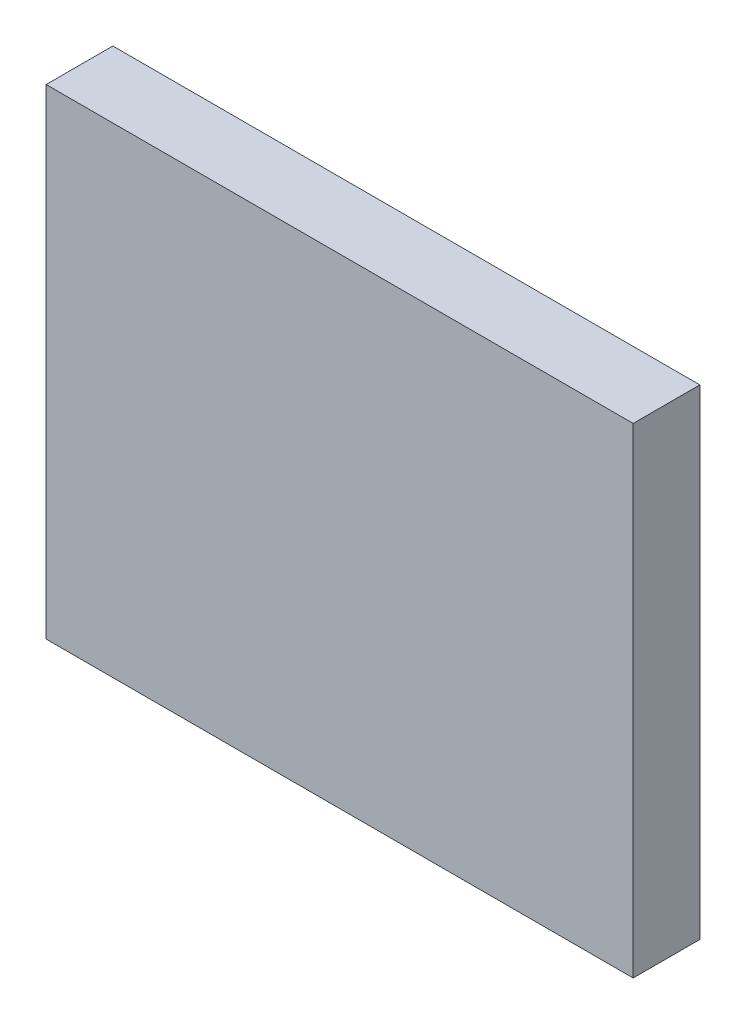
ISO-10303-21;
HEADER;
FILE_DESCRIPTION(('STEP AP214'),'2;1');
FILE_NAME('part.step','',(''),(''),'','','');
FILE_SCHEMA(('AUTOMOTIVE_DESIGN { 1 0 10303 214 1 1 1 1 }'));
ENDSEC;
DATA;
#1=APPLICATION_CONTEXT('core data for automotive mechanical design processes');
#2=APPLICATION_PROTOCOL_DEFINITION('international standard','automotive_design',2000,#1);
#3=PRODUCT_CONTEXT('',#1,'mechanical');
#4=PRODUCT('Part','Part','',(#3));
#5=PRODUCT_RELATED_PRODUCT_CATEGORY('part','',(#4));
#6=PRODUCT_DEFINITION_FORMATION('','',#4);
#7=PRODUCT_DEFINITION_CONTEXT('part definition',#1,'design');
#8=PRODUCT_DEFINITION('design','',#6,#7);
#9=PRODUCT_DEFINITION_SHAPE('','',#8);
#10=(LENGTH_UNIT() NAMED_UNIT(*) SI_UNIT(.MILLI.,.METRE.));
#11=(NAMED_UNIT(*) PLANE_ANGLE_UNIT() SI_UNIT($,.RADIAN.));
#12=(NAMED_UNIT(*) SI_UNIT($,.STERADIAN.) SOLID_ANGLE_UNIT());
#13=UNCERTAINTY_MEASURE_WITH_UNIT(LENGTH_MEASURE(1.E-05),#10,'distance_accuracy_value','');
#14=(GEOMETRIC_REPRESENTATION_CONTEXT(3) GLOBAL_UNCERTAINTY_ASSIGNED_CONTEXT((#13)) GLOBAL_UNIT_ASSIGNED_CONTEXT((#10,
#11,#12)) REPRESENTATION_CONTEXT('',''));
#15=CARTESIAN_POINT('',(0.,0.,0.));
#16=DIRECTION('',(0.,0.,1.));
#17=DIRECTION('',(1.,0.,0.));
#18=AXIS2_PLACEMENT_3D('',#15,#16,#17);
#19=CARTESIAN_POINT('',(0.,0.,10.));
#20=DIRECTION('',(1.,0.,0.));
#21=DIRECTION('',(0.,0.,-1.));
#22=AXIS2_PLACEMENT_3D('',#19,#20,#21);
#23=PLANE('',#22);
#24=DIRECTION('',(0.,-1.,0.));
#25=VECTOR('',#24,1.);
#26=CARTESIAN_POINT('',(0.,0.,0.));
#27=LINE('',#26,#25);
#28=CARTESIAN_POINT('',(0.,72.,0.));
#29=VERTEX_POINT('',#28);
#30=CARTESIAN_POINT('',(0.,0.,0.));
#31=VERTEX_POINT('',#30);
#32=EDGE_CURVE('E98',#29,#31,#27,.T.);
#33=ORIENTED_EDGE('',*,*,#32,.T.);
#34=DIRECTION('',(0.,0.,-1.));
#35=VECTOR('',#34,1.);
#36=CARTESIAN_POINT('',(0.,0.,10.));
#37=LINE('',#36,#35);
#38=CARTESIAN_POINT('',(0.,0.,10.));
#39=VERTEX_POINT('',#38);
#40=EDGE_CURVE('E11',#39,#31,#37,.T.);
#41=ORIENTED_EDGE('',*,*,#40,.F.);
#42=DIRECTION('',(0.,-1.,0.));
#43=VECTOR('',#42,1.);
#44=CARTESIAN_POINT('',(0.,0.,10.));
#45=LINE('',#44,#43);
#46=CARTESIAN_POINT('',(0.,72.,10.));
#47=VERTEX_POINT('',#46);
#48=EDGE_CURVE('E86',#47,#39,#45,.T.);
#49=ORIENTED_EDGE('',*,*,#48,.F.);
#50=DIRECTION('',(0.,0.,-1.));
#51=VECTOR('',#50,1.);
#52=CARTESIAN_POINT('',(0.,72.,10.));
#53=LINE('',#52,#51);
#54=EDGE_CURVE('E94',#47,#29,#53,.T.);
#55=ORIENTED_EDGE('',*,*,#54,.T.);
#56=EDGE_LOOP('',(#33,#41,#49,#55));
#57=FACE_BOUND('',#56,.T.);
#58=ADVANCED_FACE('F35',(#57),#23,.F.);
#59=CARTESIAN_POINT('',(0.,0.,10.));
#60=DIRECTION('',(0.,1.,0.));
#61=DIRECTION('',(0.,0.,1.));
#62=AXIS2_PLACEMENT_3D('',#59,#60,#61);
#63=PLANE('',#62);
#64=DIRECTION('',(1.,0.,0.));
#65=VECTOR('',#64,1.);
#66=CARTESIAN_POINT('',(0.,0.,0.));
#67=LINE('',#66,#65);
#68=CARTESIAN_POINT('',(88.,0.,0.));
#69=VERTEX_POINT('',#68);
#70=EDGE_CURVE('E90',#31,#69,#67,.T.);
#71=ORIENTED_EDGE('',*,*,#70,.T.);
#72=DIRECTION('',(0.,0.,-1.));
#73=VECTOR('',#72,1.);
#74=CARTESIAN_POINT('',(88.,0.,10.));
#75=LINE('',#74,#73);
#76=CARTESIAN_POINT('',(88.,0.,10.));
#77=VERTEX_POINT('',#76);
#78=EDGE_CURVE('E43',#77,#69,#75,.T.);
#79=ORIENTED_EDGE('',*,*,#78,.F.);
#80=DIRECTION('',(1.,0.,0.));
#81=VECTOR('',#80,1.);
#82=CARTESIAN_POINT('',(0.,0.,10.));
#83=LINE('',#82,#81);
#84=EDGE_CURVE('E81',#39,#77,#83,.T.);
#85=ORIENTED_EDGE('',*,*,#84,.F.);
#86=ORIENTED_EDGE('',*,*,#40,.T.);
#87=EDGE_LOOP('',(#71,#79,#85,#86));
#88=FACE_BOUND('',#87,.T.);
#89=ADVANCED_FACE('F89',(#88),#63,.F.);
#90=CARTESIAN_POINT('',(88.,0.,10.));
#91=DIRECTION('',(-1.,0.,0.));
#92=DIRECTION('',(0.,0.,1.));
#93=AXIS2_PLACEMENT_3D('',#90,#91,#92);
#94=PLANE('',#93);
#95=DIRECTION('',(0.,1.,0.));
#96=VECTOR('',#95,1.);
#97=CARTESIAN_POINT('',(88.,0.,0.));
#98=LINE('',#97,#96);
#99=CARTESIAN_POINT('',(88.,72.,0.));
#100=VERTEX_POINT('',#99);
#101=EDGE_CURVE('E68',#69,#100,#98,.T.);
#102=ORIENTED_EDGE('',*,*,#101,.T.);
#103=DIRECTION('',(0.,0.,-1.));
#104=VECTOR('',#103,1.);
#105=CARTESIAN_POINT('',(88.,72.,10.));
#106=LINE('',#105,#104);
#107=CARTESIAN_POINT('',(88.,72.,10.));
#108=VERTEX_POINT('',#107);
#109=EDGE_CURVE('E91',#108,#100,#106,.T.);
#110=ORIENTED_EDGE('',*,*,#109,.F.);
#111=DIRECTION('',(0.,1.,0.));
#112=VECTOR('',#111,1.);
#113=CARTESIAN_POINT('',(88.,0.,10.));
#114=LINE('',#113,#112);
#115=EDGE_CURVE('E84',#77,#108,#114,.T.);
#116=ORIENTED_EDGE('',*,*,#115,.F.);
#117=ORIENTED_EDGE('',*,*,#78,.T.);
#118=EDGE_LOOP('',(#102,#110,#116,#117));
#119=FACE_BOUND('',#118,.T.);
#120=ADVANCED_FACE('F92',(#119),#94,.F.);
#121=CARTESIAN_POINT('',(0.,72.,10.));
#122=DIRECTION('',(0.,-1.,0.));
#123=DIRECTION('',(0.,0.,-1.));
#124=AXIS2_PLACEMENT_3D('',#121,#122,#123);
#125=PLANE('',#124);
#126=DIRECTION('',(-1.,0.,0.));
#127=VECTOR('',#126,1.);
#128=CARTESIAN_POINT('',(0.,72.,0.));
#129=LINE('',#128,#127);
#130=EDGE_CURVE('E74',#100,#29,#129,.T.);
#131=ORIENTED_EDGE('',*,*,#130,.T.);
#132=ORIENTED_EDGE('',*,*,#54,.F.);
#133=DIRECTION('',(-1.,0.,0.));
#134=VECTOR('',#133,1.);
#135=CARTESIAN_POINT('',(0.,72.,10.));
#136=LINE('',#135,#134);
#137=EDGE_CURVE('E51',#108,#47,#136,.T.);
#138=ORIENTED_EDGE('',*,*,#137,.F.);
#139=ORIENTED_EDGE('',*,*,#109,.T.);
#140=EDGE_LOOP('',(#131,#132,#138,#139));
#141=FACE_BOUND('',#140,.T.);
#142=ADVANCED_FACE('F105',(#141),#125,.F.);
#143=CARTESIAN_POINT('',(0.,0.,10.));
#144=DIRECTION('',(0.,0.,-1.));
#145=DIRECTION('',(-1.,0.,0.));
#146=AXIS2_PLACEMENT_3D('',#143,#144,#145);
#147=PLANE('',#146);
#148=ORIENTED_EDGE('',*,*,#48,.T.);
#149=ORIENTED_EDGE('',*,*,#84,.T.);
#150=ORIENTED_EDGE('',*,*,#115,.T.);
#151=ORIENTED_EDGE('',*,*,#137,.T.);
#152=EDGE_LOOP('',(#148,#149,#150,#151));
#153=FACE_BOUND('',#152,.T.);
#154=ADVANCED_FACE('F82',(#153),#147,.F.);
#155=CARTESIAN_POINT('',(0.,0.,0.));
#156=DIRECTION('',(0.,0.,-1.));
#157=DIRECTION('',(-1.,0.,0.));
#158=AXIS2_PLACEMENT_3D('',#155,#156,#157);
#159=PLANE('',#158);
#160=ORIENTED_EDGE('',*,*,#32,.F.);
#161=ORIENTED_EDGE('',*,*,#130,.F.);
#162=ORIENTED_EDGE('',*,*,#101,.F.);
#163=ORIENTED_EDGE('',*,*,#70,.F.);
#164=EDGE_LOOP('',(#160,#161,#162,#163));
#165=FACE_BOUND('',#164,.T.);
#166=ADVANCED_FACE('F108',(#165),#159,.T.);
#167=CLOSED_SHELL('',(#58,#89,#120,#142,#154,#166));
#168=MANIFOLD_SOLID_BREP('B2',#167);
#169=ADVANCED_BREP_SHAPE_REPRESENTATION('',(#18,#168),#14);
#170=SHAPE_DEFINITION_REPRESENTATION(#9,#169);
ENDSEC;
END-ISO-10303-21;
